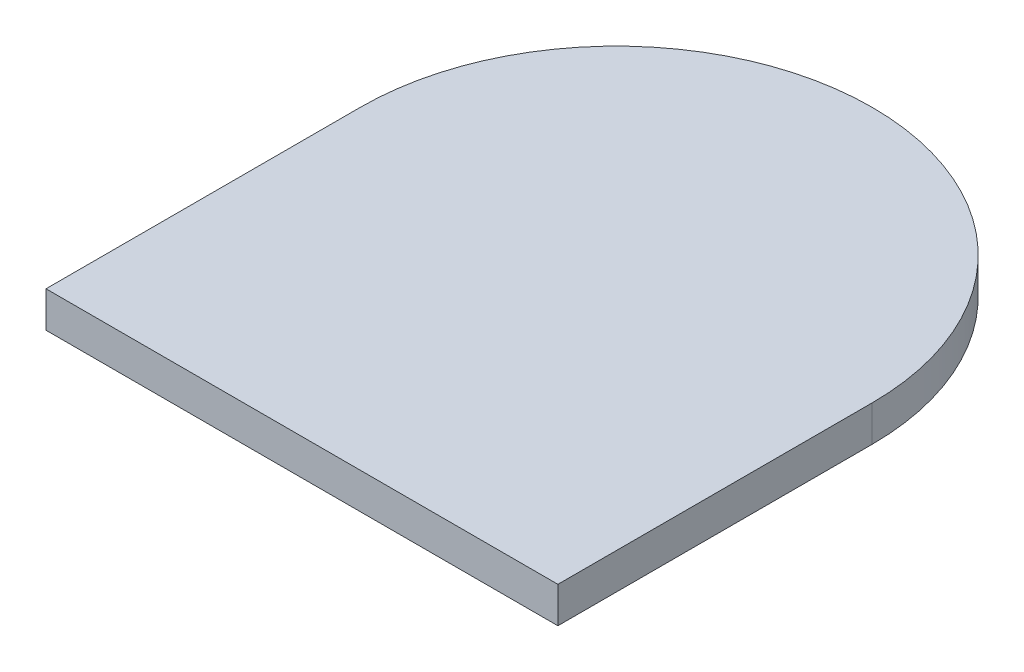
ISO-10303-21;
HEADER;
FILE_DESCRIPTION(('STEP AP214'),'2;1');
FILE_NAME('part.step','',(''),(''),'','','');
FILE_SCHEMA(('AUTOMOTIVE_DESIGN { 1 0 10303 214 1 1 1 1 }'));
ENDSEC;
DATA;
#1=APPLICATION_CONTEXT('core data for automotive mechanical design processes');
#2=APPLICATION_PROTOCOL_DEFINITION('international standard','automotive_design',2000,#1);
#3=PRODUCT_CONTEXT('',#1,'mechanical');
#4=PRODUCT('Part','Part','',(#3));
#5=PRODUCT_RELATED_PRODUCT_CATEGORY('part','',(#4));
#6=PRODUCT_DEFINITION_FORMATION('','',#4);
#7=PRODUCT_DEFINITION_CONTEXT('part definition',#1,'design');
#8=PRODUCT_DEFINITION('design','',#6,#7);
#9=PRODUCT_DEFINITION_SHAPE('','',#8);
#10=(LENGTH_UNIT() NAMED_UNIT(*) SI_UNIT(.MILLI.,.METRE.));
#11=(NAMED_UNIT(*) PLANE_ANGLE_UNIT() SI_UNIT($,.RADIAN.));
#12=(NAMED_UNIT(*) SI_UNIT($,.STERADIAN.) SOLID_ANGLE_UNIT());
#13=UNCERTAINTY_MEASURE_WITH_UNIT(LENGTH_MEASURE(1.E-05),#10,'distance_accuracy_value','');
#14=(GEOMETRIC_REPRESENTATION_CONTEXT(3) GLOBAL_UNCERTAINTY_ASSIGNED_CONTEXT((#13)) GLOBAL_UNIT_ASSIGNED_CONTEXT((#10,
#11,#12)) REPRESENTATION_CONTEXT('',''));
#15=CARTESIAN_POINT('',(0.,0.,0.));
#16=DIRECTION('',(0.,0.,1.));
#17=DIRECTION('',(1.,0.,0.));
#18=AXIS2_PLACEMENT_3D('',#15,#16,#17);
#19=CARTESIAN_POINT('',(0.,4.,0.));
#20=DIRECTION('',(0.,-1.,0.));
#21=DIRECTION('',(0.,0.,-1.));
#22=AXIS2_PLACEMENT_3D('',#19,#20,#21);
#23=CYLINDRICAL_SURFACE('',#22,28.5);
#24=CARTESIAN_POINT('',(0.,0.,0.));
#25=DIRECTION('',(0.,1.,0.));
#26=DIRECTION('',(0.,0.,1.));
#27=AXIS2_PLACEMENT_3D('',#24,#25,#26);
#28=CIRCLE('',#27,28.5);
#29=CARTESIAN_POINT('',(28.5,0.,0.));
#30=VERTEX_POINT('',#29);
#31=CARTESIAN_POINT('',(-28.5,0.,0.));
#32=VERTEX_POINT('',#31);
#33=EDGE_CURVE('E111',#30,#32,#28,.T.);
#34=ORIENTED_EDGE('',*,*,#33,.T.);
#35=DIRECTION('',(0.,-1.,0.));
#36=VECTOR('',#35,1.);
#37=CARTESIAN_POINT('',(-28.5,4.,0.));
#38=LINE('',#37,#36);
#39=CARTESIAN_POINT('',(-28.5,4.,0.));
#40=VERTEX_POINT('',#39);
#41=EDGE_CURVE('E11',#40,#32,#38,.T.);
#42=ORIENTED_EDGE('',*,*,#41,.F.);
#43=CARTESIAN_POINT('',(0.,4.,0.));
#44=DIRECTION('',(0.,1.,0.));
#45=DIRECTION('',(0.,0.,1.));
#46=AXIS2_PLACEMENT_3D('',#43,#44,#45);
#47=CIRCLE('',#46,28.5);
#48=CARTESIAN_POINT('',(28.5,4.,0.));
#49=VERTEX_POINT('',#48);
#50=EDGE_CURVE('E95',#49,#40,#47,.T.);
#51=ORIENTED_EDGE('',*,*,#50,.F.);
#52=DIRECTION('',(0.,-1.,0.));
#53=VECTOR('',#52,1.);
#54=CARTESIAN_POINT('',(28.5,4.,0.));
#55=LINE('',#54,#53);
#56=EDGE_CURVE('E107',#49,#30,#55,.T.);
#57=ORIENTED_EDGE('',*,*,#56,.T.);
#58=EDGE_LOOP('',(#34,#42,#51,#57));
#59=FACE_BOUND('',#58,.T.);
#60=ADVANCED_FACE('F43',(#59),#23,.T.);
#61=CARTESIAN_POINT('',(-28.5,4.,0.));
#62=DIRECTION('',(1.,0.,0.));
#63=DIRECTION('',(0.,0.,-1.));
#64=AXIS2_PLACEMENT_3D('',#61,#62,#63);
#65=PLANE('',#64);
#66=DIRECTION('',(0.,0.,1.));
#67=VECTOR('',#66,1.);
#68=CARTESIAN_POINT('',(-28.5,0.,0.));
#69=LINE('',#68,#67);
#70=CARTESIAN_POINT('',(-28.5,0.,35.));
#71=VERTEX_POINT('',#70);
#72=EDGE_CURVE('E100',#32,#71,#69,.T.);
#73=ORIENTED_EDGE('',*,*,#72,.T.);
#74=DIRECTION('',(0.,-1.,0.));
#75=VECTOR('',#74,1.);
#76=CARTESIAN_POINT('',(-28.5,4.,35.));
#77=LINE('',#76,#75);
#78=CARTESIAN_POINT('',(-28.5,4.,35.));
#79=VERTEX_POINT('',#78);
#80=EDGE_CURVE('E52',#79,#71,#77,.T.);
#81=ORIENTED_EDGE('',*,*,#80,.F.);
#82=DIRECTION('',(0.,0.,1.));
#83=VECTOR('',#82,1.);
#84=CARTESIAN_POINT('',(-28.5,4.,0.));
#85=LINE('',#84,#83);
#86=EDGE_CURVE('E90',#40,#79,#85,.T.);
#87=ORIENTED_EDGE('',*,*,#86,.F.);
#88=ORIENTED_EDGE('',*,*,#41,.T.);
#89=EDGE_LOOP('',(#73,#81,#87,#88));
#90=FACE_BOUND('',#89,.T.);
#91=ADVANCED_FACE('F99',(#90),#65,.F.);
#92=CARTESIAN_POINT('',(-28.5,4.,35.));
#93=DIRECTION('',(0.,0.,-1.));
#94=DIRECTION('',(-1.,0.,0.));
#95=AXIS2_PLACEMENT_3D('',#92,#93,#94);
#96=PLANE('',#95);
#97=DIRECTION('',(1.,0.,0.));
#98=VECTOR('',#97,1.);
#99=CARTESIAN_POINT('',(-28.5,0.,35.));
#100=LINE('',#99,#98);
#101=CARTESIAN_POINT('',(28.5,0.,35.));
#102=VERTEX_POINT('',#101);
#103=EDGE_CURVE('E77',#71,#102,#100,.T.);
#104=ORIENTED_EDGE('',*,*,#103,.T.);
#105=DIRECTION('',(0.,-1.,0.));
#106=VECTOR('',#105,1.);
#107=CARTESIAN_POINT('',(28.5,4.,35.));
#108=LINE('',#107,#106);
#109=CARTESIAN_POINT('',(28.5,4.,35.));
#110=VERTEX_POINT('',#109);
#111=EDGE_CURVE('E102',#110,#102,#108,.T.);
#112=ORIENTED_EDGE('',*,*,#111,.F.);
#113=DIRECTION('',(1.,0.,0.));
#114=VECTOR('',#113,1.);
#115=CARTESIAN_POINT('',(-28.5,4.,35.));
#116=LINE('',#115,#114);
#117=EDGE_CURVE('E93',#79,#110,#116,.T.);
#118=ORIENTED_EDGE('',*,*,#117,.F.);
#119=ORIENTED_EDGE('',*,*,#80,.T.);
#120=EDGE_LOOP('',(#104,#112,#118,#119));
#121=FACE_BOUND('',#120,.T.);
#122=ADVANCED_FACE('F103',(#121),#96,.F.);
#123=CARTESIAN_POINT('',(28.5,4.,35.));
#124=DIRECTION('',(-1.,0.,0.));
#125=DIRECTION('',(0.,0.,1.));
#126=AXIS2_PLACEMENT_3D('',#123,#124,#125);
#127=PLANE('',#126);
#128=DIRECTION('',(0.,0.,-1.));
#129=VECTOR('',#128,1.);
#130=CARTESIAN_POINT('',(28.5,0.,35.));
#131=LINE('',#130,#129);
#132=EDGE_CURVE('E83',#102,#30,#131,.T.);
#133=ORIENTED_EDGE('',*,*,#132,.T.);
#134=ORIENTED_EDGE('',*,*,#56,.F.);
#135=DIRECTION('',(0.,0.,-1.));
#136=VECTOR('',#135,1.);
#137=CARTESIAN_POINT('',(28.5,4.,35.));
#138=LINE('',#137,#136);
#139=EDGE_CURVE('E60',#110,#49,#138,.T.);
#140=ORIENTED_EDGE('',*,*,#139,.F.);
#141=ORIENTED_EDGE('',*,*,#111,.T.);
#142=EDGE_LOOP('',(#133,#134,#140,#141));
#143=FACE_BOUND('',#142,.T.);
#144=ADVANCED_FACE('F124',(#143),#127,.F.);
#145=CARTESIAN_POINT('',(0.,4.,0.));
#146=DIRECTION('',(0.,1.,0.));
#147=DIRECTION('',(0.,0.,1.));
#148=AXIS2_PLACEMENT_3D('',#145,#146,#147);
#149=PLANE('',#148);
#150=ORIENTED_EDGE('',*,*,#50,.T.);
#151=ORIENTED_EDGE('',*,*,#86,.T.);
#152=ORIENTED_EDGE('',*,*,#117,.T.);
#153=ORIENTED_EDGE('',*,*,#139,.T.);
#154=EDGE_LOOP('',(#150,#151,#152,#153));
#155=FACE_BOUND('',#154,.T.);
#156=ADVANCED_FACE('F91',(#155),#149,.T.);
#157=CARTESIAN_POINT('',(0.,0.,0.));
#158=DIRECTION('',(0.,1.,0.));
#159=DIRECTION('',(0.,0.,1.));
#160=AXIS2_PLACEMENT_3D('',#157,#158,#159);
#161=PLANE('',#160);
#162=ORIENTED_EDGE('',*,*,#33,.F.);
#163=ORIENTED_EDGE('',*,*,#132,.F.);
#164=ORIENTED_EDGE('',*,*,#103,.F.);
#165=ORIENTED_EDGE('',*,*,#72,.F.);
#166=EDGE_LOOP('',(#162,#163,#164,#165));
#167=FACE_BOUND('',#166,.T.);
#168=ADVANCED_FACE('F127',(#167),#161,.F.);
#169=CLOSED_SHELL('',(#60,#91,#122,#144,#156,#168));
#170=MANIFOLD_SOLID_BREP('B2',#169);
#171=ADVANCED_BREP_SHAPE_REPRESENTATION('',(#18,#170),#14);
#172=SHAPE_DEFINITION_REPRESENTATION(#9,#171);
ENDSEC;
END-ISO-10303-21;
